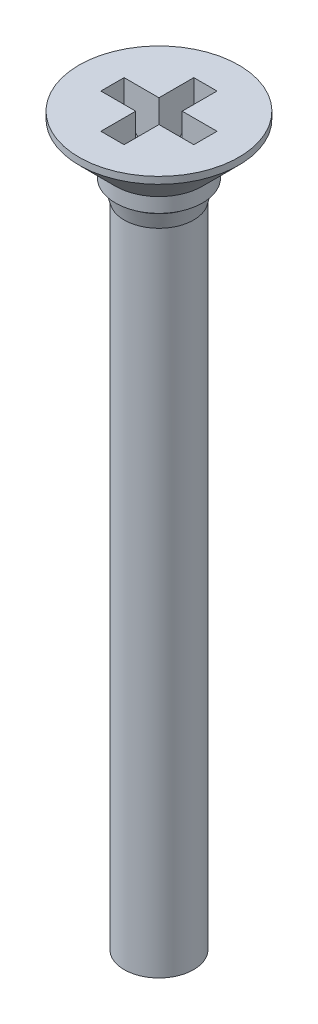
ISO-10303-21;
HEADER;
FILE_DESCRIPTION(('STEP AP214'),'2;1');
FILE_NAME('part.step','',(''),(''),'','','');
FILE_SCHEMA(('AUTOMOTIVE_DESIGN { 1 0 10303 214 1 1 1 1 }'));
ENDSEC;
DATA;
#1=APPLICATION_CONTEXT('core data for automotive mechanical design processes');
#2=APPLICATION_PROTOCOL_DEFINITION('international standard','automotive_design',2000,#1);
#3=PRODUCT_CONTEXT('',#1,'mechanical');
#4=PRODUCT('Part','Part','',(#3));
#5=PRODUCT_RELATED_PRODUCT_CATEGORY('part','',(#4));
#6=PRODUCT_DEFINITION_FORMATION('','',#4);
#7=PRODUCT_DEFINITION_CONTEXT('part definition',#1,'design');
#8=PRODUCT_DEFINITION('design','',#6,#7);
#9=PRODUCT_DEFINITION_SHAPE('','',#8);
#10=(LENGTH_UNIT() NAMED_UNIT(*) SI_UNIT(.MILLI.,.METRE.));
#11=(NAMED_UNIT(*) PLANE_ANGLE_UNIT() SI_UNIT($,.RADIAN.));
#12=(NAMED_UNIT(*) SI_UNIT($,.STERADIAN.) SOLID_ANGLE_UNIT());
#13=UNCERTAINTY_MEASURE_WITH_UNIT(LENGTH_MEASURE(1.E-05),#10,'distance_accuracy_value','');
#14=(GEOMETRIC_REPRESENTATION_CONTEXT(3) GLOBAL_UNCERTAINTY_ASSIGNED_CONTEXT((#13)) GLOBAL_UNIT_ASSIGNED_CONTEXT((#10,
#11,#12)) REPRESENTATION_CONTEXT('',''));
#15=CARTESIAN_POINT('',(0.,0.,0.));
#16=DIRECTION('',(0.,0.,1.));
#17=DIRECTION('',(1.,0.,0.));
#18=AXIS2_PLACEMENT_3D('',#15,#16,#17);
#19=CARTESIAN_POINT('',(0.,-2.65,-0.4));
#20=DIRECTION('',(0.,0.,-1.));
#21=DIRECTION('',(-1.,0.,0.));
#22=AXIS2_PLACEMENT_3D('',#19,#20,#21);
#23=PLANE('',#22);
#24=DIRECTION('',(0.,1.,0.));
#25=VECTOR('',#24,1.);
#26=CARTESIAN_POINT('',(0.4,-2.65,-0.4));
#27=LINE('',#26,#25);
#28=CARTESIAN_POINT('',(0.4,-2.1,-0.4));
#29=VERTEX_POINT('',#28);
#30=CARTESIAN_POINT('',(0.4,0.,-0.4));
#31=VERTEX_POINT('',#30);
#32=EDGE_CURVE('E203',#29,#31,#27,.T.);
#33=ORIENTED_EDGE('',*,*,#32,.F.);
#34=DIRECTION('',(1.,0.,0.));
#35=VECTOR('',#34,1.);
#36=CARTESIAN_POINT('',(-0.550000000000002,-2.1,-0.4));
#37=LINE('',#36,#35);
#38=CARTESIAN_POINT('',(0.550000000000002,-2.1,-0.4));
#39=VERTEX_POINT('',#38);
#40=EDGE_CURVE('E238',#29,#39,#37,.T.);
#41=ORIENTED_EDGE('',*,*,#40,.T.);
#42=DIRECTION('',(0.707106781186546,0.707106781186548,0.));
#43=VECTOR('',#42,1.);
#44=CARTESIAN_POINT('',(1.6,-1.05,-0.4));
#45=LINE('',#44,#43);
#46=CARTESIAN_POINT('',(1.6,-1.05,-0.4));
#47=VERTEX_POINT('',#46);
#48=EDGE_CURVE('E242',#39,#47,#45,.T.);
#49=ORIENTED_EDGE('',*,*,#48,.T.);
#50=DIRECTION('',(0.,1.,0.));
#51=VECTOR('',#50,1.);
#52=CARTESIAN_POINT('',(1.6,0.,-0.4));
#53=LINE('',#52,#51);
#54=CARTESIAN_POINT('',(1.6,0.,-0.4));
#55=VERTEX_POINT('',#54);
#56=EDGE_CURVE('E245',#47,#55,#53,.T.);
#57=ORIENTED_EDGE('',*,*,#56,.T.);
#58=DIRECTION('',(-1.,0.,0.));
#59=VECTOR('',#58,1.);
#60=CARTESIAN_POINT('',(1.6,0.,-0.4));
#61=LINE('',#60,#59);
#62=EDGE_CURVE('E249',#55,#31,#61,.T.);
#63=ORIENTED_EDGE('',*,*,#62,.T.);
#64=EDGE_LOOP('',(#33,#41,#49,#57,#63));
#65=FACE_BOUND('',#64,.T.);
#66=ADVANCED_FACE('F38',(#65),#23,.F.);
#67=CARTESIAN_POINT('',(0.,-2.65,0.4));
#68=DIRECTION('',(0.,0.,-1.));
#69=DIRECTION('',(-1.,0.,0.));
#70=AXIS2_PLACEMENT_3D('',#67,#68,#69);
#71=PLANE('',#70);
#72=DIRECTION('',(1.,0.,0.));
#73=VECTOR('',#72,1.);
#74=CARTESIAN_POINT('',(-0.550000000000002,-2.1,0.4));
#75=LINE('',#74,#73);
#76=CARTESIAN_POINT('',(0.4,-2.1,0.4));
#77=VERTEX_POINT('',#76);
#78=CARTESIAN_POINT('',(0.550000000000002,-2.1,0.4));
#79=VERTEX_POINT('',#78);
#80=EDGE_CURVE('E220',#77,#79,#75,.T.);
#81=ORIENTED_EDGE('',*,*,#80,.F.);
#82=DIRECTION('',(0.,1.,0.));
#83=VECTOR('',#82,1.);
#84=CARTESIAN_POINT('',(0.4,-2.65,0.4));
#85=LINE('',#84,#83);
#86=CARTESIAN_POINT('',(0.4,0.,0.4));
#87=VERTEX_POINT('',#86);
#88=EDGE_CURVE('E46',#77,#87,#85,.T.);
#89=ORIENTED_EDGE('',*,*,#88,.T.);
#90=DIRECTION('',(-1.,0.,0.));
#91=VECTOR('',#90,1.);
#92=CARTESIAN_POINT('',(1.6,0.,0.4));
#93=LINE('',#92,#91);
#94=CARTESIAN_POINT('',(1.6,0.,0.4));
#95=VERTEX_POINT('',#94);
#96=EDGE_CURVE('E229',#95,#87,#93,.T.);
#97=ORIENTED_EDGE('',*,*,#96,.F.);
#98=DIRECTION('',(0.,1.,0.));
#99=VECTOR('',#98,1.);
#100=CARTESIAN_POINT('',(1.6,0.,0.4));
#101=LINE('',#100,#99);
#102=CARTESIAN_POINT('',(1.6,-1.05,0.4));
#103=VERTEX_POINT('',#102);
#104=EDGE_CURVE('E226',#103,#95,#101,.T.);
#105=ORIENTED_EDGE('',*,*,#104,.F.);
#106=DIRECTION('',(0.707106781186546,0.707106781186548,0.));
#107=VECTOR('',#106,1.);
#108=CARTESIAN_POINT('',(1.6,-1.05,0.4));
#109=LINE('',#108,#107);
#110=EDGE_CURVE('E223',#79,#103,#109,.T.);
#111=ORIENTED_EDGE('',*,*,#110,.F.);
#112=EDGE_LOOP('',(#81,#89,#97,#105,#111));
#113=FACE_BOUND('',#112,.T.);
#114=ADVANCED_FACE('F292',(#113),#71,.T.);
#115=CARTESIAN_POINT('',(0.,0.,0.));
#116=DIRECTION('',(0.,-1.,0.));
#117=DIRECTION('',(1.,0.,0.));
#118=AXIS2_PLACEMENT_3D('',#115,#116,#117);
#119=PLANE('',#118);
#120=DIRECTION('',(1.,0.,0.));
#121=VECTOR('',#120,1.);
#122=CARTESIAN_POINT('',(-0.4,0.,1.6));
#123=LINE('',#122,#121);
#124=CARTESIAN_POINT('',(-0.4,0.,1.6));
#125=VERTEX_POINT('',#124);
#126=CARTESIAN_POINT('',(0.4,0.,1.6));
#127=VERTEX_POINT('',#126);
#128=EDGE_CURVE('E204',#125,#127,#123,.T.);
#129=ORIENTED_EDGE('',*,*,#128,.F.);
#130=DIRECTION('',(0.,0.,1.));
#131=VECTOR('',#130,1.);
#132=CARTESIAN_POINT('',(-0.4,0.,-1.6));
#133=LINE('',#132,#131);
#134=CARTESIAN_POINT('',(-0.4,0.,0.399999999999999));
#135=VERTEX_POINT('',#134);
#136=EDGE_CURVE('E197',#135,#125,#133,.T.);
#137=ORIENTED_EDGE('',*,*,#136,.F.);
#138=CARTESIAN_POINT('',(-1.6,0.,0.4));
#139=VERTEX_POINT('',#138);
#140=EDGE_CURVE('E228',#135,#139,#93,.T.);
#141=ORIENTED_EDGE('',*,*,#140,.T.);
#142=DIRECTION('',(0.,0.,1.));
#143=VECTOR('',#142,1.);
#144=CARTESIAN_POINT('',(-1.6,0.,-0.4));
#145=LINE('',#144,#143);
#146=CARTESIAN_POINT('',(-1.6,0.,-0.4));
#147=VERTEX_POINT('',#146);
#148=EDGE_CURVE('E259',#147,#139,#145,.T.);
#149=ORIENTED_EDGE('',*,*,#148,.F.);
#150=CARTESIAN_POINT('',(-0.4,0.,-0.4));
#151=VERTEX_POINT('',#150);
#152=EDGE_CURVE('E248',#151,#147,#61,.T.);
#153=ORIENTED_EDGE('',*,*,#152,.F.);
#154=CARTESIAN_POINT('',(-0.4,0.,-1.6));
#155=VERTEX_POINT('',#154);
#156=EDGE_CURVE('E198',#155,#151,#133,.T.);
#157=ORIENTED_EDGE('',*,*,#156,.F.);
#158=DIRECTION('',(1.,0.,0.));
#159=VECTOR('',#158,1.);
#160=CARTESIAN_POINT('',(-0.4,0.,-1.6));
#161=LINE('',#160,#159);
#162=CARTESIAN_POINT('',(0.4,0.,-1.6));
#163=VERTEX_POINT('',#162);
#164=EDGE_CURVE('E206',#155,#163,#161,.T.);
#165=ORIENTED_EDGE('',*,*,#164,.T.);
#166=DIRECTION('',(0.,0.,1.));
#167=VECTOR('',#166,1.);
#168=CARTESIAN_POINT('',(0.4,0.,-1.6));
#169=LINE('',#168,#167);
#170=EDGE_CURVE('E182',#163,#31,#169,.T.);
#171=ORIENTED_EDGE('',*,*,#170,.T.);
#172=ORIENTED_EDGE('',*,*,#62,.F.);
#173=DIRECTION('',(0.,0.,1.));
#174=VECTOR('',#173,1.);
#175=CARTESIAN_POINT('',(1.6,0.,-0.4));
#176=LINE('',#175,#174);
#177=EDGE_CURVE('E262',#55,#95,#176,.T.);
#178=ORIENTED_EDGE('',*,*,#177,.T.);
#179=ORIENTED_EDGE('',*,*,#96,.T.);
#180=EDGE_CURVE('E61',#87,#127,#169,.T.);
#181=ORIENTED_EDGE('',*,*,#180,.T.);
#182=EDGE_LOOP('',(#129,#137,#141,#149,#153,#157,#165,#171,#172,#178,#179,#181));
#183=FACE_BOUND('',#182,.T.);
#184=CARTESIAN_POINT('',(0.,0.,0.));
#185=DIRECTION('',(0.,1.,0.));
#186=DIRECTION('',(-1.,0.,0.));
#187=AXIS2_PLACEMENT_3D('',#184,#185,#186);
#188=CIRCLE('',#187,2.75);
#189=CARTESIAN_POINT('',(-2.75,0.,0.));
#190=VERTEX_POINT('',#189);
#191=EDGE_CURVE('E288',#190,#190,#188,.T.);
#192=ORIENTED_EDGE('',*,*,#191,.T.);
#193=EDGE_LOOP('',(#192));
#194=FACE_BOUND('',#193,.T.);
#195=ADVANCED_FACE('F40',(#183,#194),#119,.F.);
#196=CARTESIAN_POINT('',(0.,0.,0.));
#197=DIRECTION('',(0.,1.,0.));
#198=DIRECTION('',(-1.,0.,0.));
#199=AXIS2_PLACEMENT_3D('',#196,#197,#198);
#200=CYLINDRICAL_SURFACE('',#199,2.75);
#201=ORIENTED_EDGE('',*,*,#191,.F.);
#202=EDGE_LOOP('',(#201));
#203=FACE_BOUND('',#202,.T.);
#204=CARTESIAN_POINT('',(0.,-0.237500000000007,0.));
#205=DIRECTION('',(0.,1.,0.));
#206=DIRECTION('',(-1.,0.,0.));
#207=AXIS2_PLACEMENT_3D('',#204,#205,#206);
#208=CIRCLE('',#207,2.75);
#209=CARTESIAN_POINT('',(-2.75,-0.237500000000007,0.));
#210=VERTEX_POINT('',#209);
#211=EDGE_CURVE('E285',#210,#210,#208,.T.);
#212=ORIENTED_EDGE('',*,*,#211,.T.);
#213=EDGE_LOOP('',(#212));
#214=FACE_BOUND('',#213,.T.);
#215=ADVANCED_FACE('F397',(#203,#214),#200,.T.);
#216=CARTESIAN_POINT('',(0.,-1.4875,0.));
#217=DIRECTION('',(0.,1.,0.));
#218=DIRECTION('',(-1.,0.,0.));
#219=AXIS2_PLACEMENT_3D('',#216,#217,#218);
#220=CONICAL_SURFACE('',#219,1.5,0.78539816339745);
#221=ORIENTED_EDGE('',*,*,#211,.F.);
#222=EDGE_LOOP('',(#221));
#223=FACE_BOUND('',#222,.T.);
#224=CARTESIAN_POINT('',(0.,-1.4875,0.));
#225=DIRECTION('',(0.,1.,0.));
#226=DIRECTION('',(-1.,0.,0.));
#227=AXIS2_PLACEMENT_3D('',#224,#225,#226);
#228=CIRCLE('',#227,1.5);
#229=CARTESIAN_POINT('',(-1.5,-1.4875,0.));
#230=VERTEX_POINT('',#229);
#231=EDGE_CURVE('E282',#230,#230,#228,.T.);
#232=ORIENTED_EDGE('',*,*,#231,.T.);
#233=EDGE_LOOP('',(#232));
#234=FACE_BOUND('',#233,.T.);
#235=ADVANCED_FACE('F394',(#223,#234),#220,.T.);
#236=CARTESIAN_POINT('',(0.,0.,0.));
#237=DIRECTION('',(0.,1.,0.));
#238=DIRECTION('',(-1.,0.,0.));
#239=AXIS2_PLACEMENT_3D('',#236,#237,#238);
#240=CYLINDRICAL_SURFACE('',#239,1.5);
#241=ORIENTED_EDGE('',*,*,#231,.F.);
#242=EDGE_LOOP('',(#241));
#243=FACE_BOUND('',#242,.T.);
#244=CARTESIAN_POINT('',(0.,-1.9875,0.));
#245=DIRECTION('',(0.,1.,0.));
#246=DIRECTION('',(-1.,0.,0.));
#247=AXIS2_PLACEMENT_3D('',#244,#245,#246);
#248=CIRCLE('',#247,1.5);
#249=CARTESIAN_POINT('',(-1.5,-1.9875,0.));
#250=VERTEX_POINT('',#249);
#251=EDGE_CURVE('E279',#250,#250,#248,.T.);
#252=ORIENTED_EDGE('',*,*,#251,.T.);
#253=EDGE_LOOP('',(#252));
#254=FACE_BOUND('',#253,.T.);
#255=ADVANCED_FACE('F390',(#243,#254),#240,.T.);
#256=CARTESIAN_POINT('',(1.5,-1.9875,0.));
#257=DIRECTION('',(0.,1.,0.));
#258=DIRECTION('',(-1.,0.,0.));
#259=AXIS2_PLACEMENT_3D('',#256,#257,#258);
#260=PLANE('',#259);
#261=ORIENTED_EDGE('',*,*,#251,.F.);
#262=EDGE_LOOP('',(#261));
#263=FACE_BOUND('',#262,.T.);
#264=CARTESIAN_POINT('',(0.,-1.9875,0.));
#265=DIRECTION('',(0.,1.,0.));
#266=DIRECTION('',(-1.,0.,0.));
#267=AXIS2_PLACEMENT_3D('',#264,#265,#266);
#268=CIRCLE('',#267,1.3375);
#269=CARTESIAN_POINT('',(-1.3375,-1.9875,0.));
#270=VERTEX_POINT('',#269);
#271=EDGE_CURVE('E276',#270,#270,#268,.T.);
#272=ORIENTED_EDGE('',*,*,#271,.T.);
#273=EDGE_LOOP('',(#272));
#274=FACE_BOUND('',#273,.T.);
#275=ADVANCED_FACE('F386',(#263,#274),#260,.F.);
#276=CARTESIAN_POINT('',(0.,0.,0.));
#277=DIRECTION('',(0.,1.,0.));
#278=DIRECTION('',(-1.,0.,0.));
#279=AXIS2_PLACEMENT_3D('',#276,#277,#278);
#280=CYLINDRICAL_SURFACE('',#279,1.3375);
#281=ORIENTED_EDGE('',*,*,#271,.F.);
#282=EDGE_LOOP('',(#281));
#283=FACE_BOUND('',#282,.T.);
#284=CARTESIAN_POINT('',(0.,-2.11258468371008,0.));
#285=DIRECTION('',(0.,1.,0.));
#286=DIRECTION('',(-1.,0.,0.));
#287=AXIS2_PLACEMENT_3D('',#284,#285,#286);
#288=CIRCLE('',#287,1.3375);
#289=CARTESIAN_POINT('',(-1.3375,-2.11258468371008,0.));
#290=VERTEX_POINT('',#289);
#291=EDGE_CURVE('E273',#290,#290,#288,.T.);
#292=ORIENTED_EDGE('',*,*,#291,.T.);
#293=EDGE_LOOP('',(#292));
#294=FACE_BOUND('',#293,.T.);
#295=ADVANCED_FACE('F382',(#283,#294),#280,.T.);
#296=CARTESIAN_POINT('',(0.,-2.65,0.));
#297=DIRECTION('',(0.,1.,0.));
#298=DIRECTION('',(-1.,0.,0.));
#299=AXIS2_PLACEMENT_3D('',#296,#297,#298);
#300=CONICAL_SURFACE('',#299,1.1935,0.26179938779915);
#301=ORIENTED_EDGE('',*,*,#291,.F.);
#302=EDGE_LOOP('',(#301));
#303=FACE_BOUND('',#302,.T.);
#304=CARTESIAN_POINT('',(0.,-2.65,0.));
#305=DIRECTION('',(0.,1.,0.));
#306=DIRECTION('',(-1.,0.,0.));
#307=AXIS2_PLACEMENT_3D('',#304,#305,#306);
#308=CIRCLE('',#307,1.1935);
#309=CARTESIAN_POINT('',(-1.1935,-2.65,0.));
#310=VERTEX_POINT('',#309);
#311=EDGE_CURVE('E258',#310,#310,#308,.T.);
#312=ORIENTED_EDGE('',*,*,#311,.T.);
#313=EDGE_LOOP('',(#312));
#314=FACE_BOUND('',#313,.T.);
#315=ADVANCED_FACE('F378',(#303,#314),#300,.T.);
#316=CARTESIAN_POINT('',(0.,0.,0.));
#317=DIRECTION('',(0.,1.,0.));
#318=DIRECTION('',(-1.,0.,0.));
#319=AXIS2_PLACEMENT_3D('',#316,#317,#318);
#320=CYLINDRICAL_SURFACE('',#319,1.1935);
#321=ORIENTED_EDGE('',*,*,#311,.F.);
#322=EDGE_LOOP('',(#321));
#323=FACE_BOUND('',#322,.T.);
#324=CARTESIAN_POINT('',(0.,-25.,0.));
#325=DIRECTION('',(0.,-1.,0.));
#326=DIRECTION('',(1.,0.,0.));
#327=AXIS2_PLACEMENT_3D('',#324,#325,#326);
#328=CIRCLE('',#327,1.1935);
#329=CARTESIAN_POINT('',(1.1935,-25.,0.));
#330=VERTEX_POINT('',#329);
#331=EDGE_CURVE('E173',#330,#330,#328,.T.);
#332=ORIENTED_EDGE('',*,*,#331,.F.);
#333=EDGE_LOOP('',(#332));
#334=FACE_BOUND('',#333,.T.);
#335=ADVANCED_FACE('F375',(#323,#334),#320,.T.);
#336=CARTESIAN_POINT('',(-1.6,-1.05,-0.4));
#337=DIRECTION('',(-0.707106781186548,-0.707106781186546,0.));
#338=DIRECTION('',(0.707106781186547,-0.707106781186548,0.));
#339=AXIS2_PLACEMENT_3D('',#336,#337,#338);
#340=PLANE('',#339);
#341=DIRECTION('',(0.,0.,1.));
#342=VECTOR('',#341,1.);
#343=CARTESIAN_POINT('',(-0.550000000000002,-2.1,-0.4));
#344=LINE('',#343,#342);
#345=CARTESIAN_POINT('',(-0.550000000000002,-2.1,-0.4));
#346=VERTEX_POINT('',#345);
#347=CARTESIAN_POINT('',(-0.550000000000002,-2.1,0.4));
#348=VERTEX_POINT('',#347);
#349=EDGE_CURVE('E255',#346,#348,#344,.T.);
#350=ORIENTED_EDGE('',*,*,#349,.F.);
#351=DIRECTION('',(0.707106781186546,-0.707106781186548,0.));
#352=VECTOR('',#351,1.);
#353=CARTESIAN_POINT('',(-1.6,-1.05,-0.4));
#354=LINE('',#353,#352);
#355=CARTESIAN_POINT('',(-1.6,-1.05,-0.4));
#356=VERTEX_POINT('',#355);
#357=EDGE_CURVE('E235',#356,#346,#354,.T.);
#358=ORIENTED_EDGE('',*,*,#357,.F.);
#359=DIRECTION('',(0.,0.,1.));
#360=VECTOR('',#359,1.);
#361=CARTESIAN_POINT('',(-1.6,-1.05,-0.4));
#362=LINE('',#361,#360);
#363=CARTESIAN_POINT('',(-1.6,-1.05,0.4));
#364=VERTEX_POINT('',#363);
#365=EDGE_CURVE('E256',#356,#364,#362,.T.);
#366=ORIENTED_EDGE('',*,*,#365,.T.);
#367=DIRECTION('',(0.707106781186546,-0.707106781186548,0.));
#368=VECTOR('',#367,1.);
#369=CARTESIAN_POINT('',(-1.6,-1.05,0.4));
#370=LINE('',#369,#368);
#371=EDGE_CURVE('E217',#364,#348,#370,.T.);
#372=ORIENTED_EDGE('',*,*,#371,.T.);
#373=EDGE_LOOP('',(#350,#358,#366,#372));
#374=FACE_BOUND('',#373,.T.);
#375=ADVANCED_FACE('F329',(#374),#340,.F.);
#376=CARTESIAN_POINT('',(-1.6,0.,-0.4));
#377=DIRECTION('',(-1.,0.,0.));
#378=DIRECTION('',(0.,0.,1.));
#379=AXIS2_PLACEMENT_3D('',#376,#377,#378);
#380=PLANE('',#379);
#381=ORIENTED_EDGE('',*,*,#365,.F.);
#382=DIRECTION('',(0.,-1.,0.));
#383=VECTOR('',#382,1.);
#384=CARTESIAN_POINT('',(-1.6,0.,-0.4));
#385=LINE('',#384,#383);
#386=EDGE_CURVE('E252',#147,#356,#385,.T.);
#387=ORIENTED_EDGE('',*,*,#386,.F.);
#388=ORIENTED_EDGE('',*,*,#148,.T.);
#389=DIRECTION('',(0.,-1.,0.));
#390=VECTOR('',#389,1.);
#391=CARTESIAN_POINT('',(-1.6,0.,0.4));
#392=LINE('',#391,#390);
#393=EDGE_CURVE('E232',#139,#364,#392,.T.);
#394=ORIENTED_EDGE('',*,*,#393,.T.);
#395=EDGE_LOOP('',(#381,#387,#388,#394));
#396=FACE_BOUND('',#395,.T.);
#397=ADVANCED_FACE('F374',(#396),#380,.F.);
#398=CARTESIAN_POINT('',(1.6,0.,-0.4));
#399=DIRECTION('',(1.,0.,0.));
#400=DIRECTION('',(0.,0.,-1.));
#401=AXIS2_PLACEMENT_3D('',#398,#399,#400);
#402=PLANE('',#401);
#403=ORIENTED_EDGE('',*,*,#177,.F.);
#404=ORIENTED_EDGE('',*,*,#56,.F.);
#405=DIRECTION('',(0.,0.,1.));
#406=VECTOR('',#405,1.);
#407=CARTESIAN_POINT('',(1.6,-1.05,-0.4));
#408=LINE('',#407,#406);
#409=EDGE_CURVE('E265',#47,#103,#408,.T.);
#410=ORIENTED_EDGE('',*,*,#409,.T.);
#411=ORIENTED_EDGE('',*,*,#104,.T.);
#412=EDGE_LOOP('',(#403,#404,#410,#411));
#413=FACE_BOUND('',#412,.T.);
#414=ADVANCED_FACE('F301',(#413),#402,.F.);
#415=CARTESIAN_POINT('',(1.6,-1.05,-0.4));
#416=DIRECTION('',(0.707106781186548,-0.707106781186546,0.));
#417=DIRECTION('',(0.707106781186547,0.707106781186548,0.));
#418=AXIS2_PLACEMENT_3D('',#415,#416,#417);
#419=PLANE('',#418);
#420=ORIENTED_EDGE('',*,*,#409,.F.);
#421=ORIENTED_EDGE('',*,*,#48,.F.);
#422=DIRECTION('',(0.,0.,1.));
#423=VECTOR('',#422,1.);
#424=CARTESIAN_POINT('',(0.550000000000002,-2.1,-0.4));
#425=LINE('',#424,#423);
#426=EDGE_CURVE('E267',#39,#79,#425,.T.);
#427=ORIENTED_EDGE('',*,*,#426,.T.);
#428=ORIENTED_EDGE('',*,*,#110,.T.);
#429=EDGE_LOOP('',(#420,#421,#427,#428));
#430=FACE_BOUND('',#429,.T.);
#431=ADVANCED_FACE('F307',(#430),#419,.F.);
#432=CARTESIAN_POINT('',(-0.550000000000002,-2.1,-0.4));
#433=DIRECTION('',(0.,-1.,0.));
#434=DIRECTION('',(0.,0.,-1.));
#435=AXIS2_PLACEMENT_3D('',#432,#433,#434);
#436=PLANE('',#435);
#437=CARTESIAN_POINT('',(-0.4,-2.1,0.4));
#438=VERTEX_POINT('',#437);
#439=EDGE_CURVE('E221',#348,#438,#75,.T.);
#440=ORIENTED_EDGE('',*,*,#439,.T.);
#441=DIRECTION('',(0.,0.,-1.));
#442=VECTOR('',#441,1.);
#443=CARTESIAN_POINT('',(-0.4,-2.1,0.550000000000002));
#444=LINE('',#443,#442);
#445=CARTESIAN_POINT('',(-0.4,-2.1,0.550000000000002));
#446=VERTEX_POINT('',#445);
#447=EDGE_CURVE('E157',#446,#438,#444,.T.);
#448=ORIENTED_EDGE('',*,*,#447,.F.);
#449=DIRECTION('',(1.,0.,0.));
#450=VECTOR('',#449,1.);
#451=CARTESIAN_POINT('',(-0.4,-2.1,0.550000000000002));
#452=LINE('',#451,#450);
#453=CARTESIAN_POINT('',(0.4,-2.1,0.550000000000002));
#454=VERTEX_POINT('',#453);
#455=EDGE_CURVE('E151',#446,#454,#452,.T.);
#456=ORIENTED_EDGE('',*,*,#455,.T.);
#457=DIRECTION('',(0.,0.,-1.));
#458=VECTOR('',#457,1.);
#459=CARTESIAN_POINT('',(0.4,-2.1,0.550000000000002));
#460=LINE('',#459,#458);
#461=EDGE_CURVE('E155',#454,#77,#460,.T.);
#462=ORIENTED_EDGE('',*,*,#461,.T.);
#463=ORIENTED_EDGE('',*,*,#80,.T.);
#464=ORIENTED_EDGE('',*,*,#426,.F.);
#465=ORIENTED_EDGE('',*,*,#40,.F.);
#466=CARTESIAN_POINT('',(0.4,-2.1,-0.550000000000002));
#467=VERTEX_POINT('',#466);
#468=EDGE_CURVE('E53',#29,#467,#460,.T.);
#469=ORIENTED_EDGE('',*,*,#468,.T.);
#470=DIRECTION('',(1.,0.,0.));
#471=VECTOR('',#470,1.);
#472=CARTESIAN_POINT('',(-0.4,-2.1,-0.550000000000002));
#473=LINE('',#472,#471);
#474=CARTESIAN_POINT('',(-0.4,-2.1,-0.550000000000002));
#475=VERTEX_POINT('',#474);
#476=EDGE_CURVE('E162',#475,#467,#473,.T.);
#477=ORIENTED_EDGE('',*,*,#476,.F.);
#478=CARTESIAN_POINT('',(-0.4,-2.1,-0.4));
#479=VERTEX_POINT('',#478);
#480=EDGE_CURVE('E189',#479,#475,#444,.T.);
#481=ORIENTED_EDGE('',*,*,#480,.F.);
#482=EDGE_CURVE('E239',#346,#479,#37,.T.);
#483=ORIENTED_EDGE('',*,*,#482,.F.);
#484=ORIENTED_EDGE('',*,*,#349,.T.);
#485=EDGE_LOOP('',(#440,#448,#456,#462,#463,#464,#465,#469,#477,#481,#483,#484));
#486=FACE_BOUND('',#485,.T.);
#487=ADVANCED_FACE('F154',(#486),#436,.F.);
#488=ORIENTED_EDGE('',*,*,#482,.T.);
#489=DIRECTION('',(0.,1.,0.));
#490=VECTOR('',#489,1.);
#491=CARTESIAN_POINT('',(-0.4,-2.65,-0.4));
#492=LINE('',#491,#490);
#493=EDGE_CURVE('E214',#479,#151,#492,.T.);
#494=ORIENTED_EDGE('',*,*,#493,.T.);
#495=ORIENTED_EDGE('',*,*,#152,.T.);
#496=ORIENTED_EDGE('',*,*,#386,.T.);
#497=ORIENTED_EDGE('',*,*,#357,.T.);
#498=EDGE_LOOP('',(#488,#494,#495,#496,#497));
#499=FACE_BOUND('',#498,.T.);
#500=ADVANCED_FACE('F324',(#499),#23,.F.);
#501=DIRECTION('',(0.,1.,0.));
#502=VECTOR('',#501,1.);
#503=CARTESIAN_POINT('',(-0.4,-2.65,0.4));
#504=LINE('',#503,#502);
#505=EDGE_CURVE('E11',#438,#135,#504,.T.);
#506=ORIENTED_EDGE('',*,*,#505,.F.);
#507=ORIENTED_EDGE('',*,*,#439,.F.);
#508=ORIENTED_EDGE('',*,*,#371,.F.);
#509=ORIENTED_EDGE('',*,*,#393,.F.);
#510=ORIENTED_EDGE('',*,*,#140,.F.);
#511=EDGE_LOOP('',(#506,#507,#508,#509,#510));
#512=FACE_BOUND('',#511,.T.);
#513=ADVANCED_FACE('F334',(#512),#71,.T.);
#514=CARTESIAN_POINT('',(-0.4,-1.05,1.6));
#515=DIRECTION('',(0.,-0.707106781186546,0.707106781186548));
#516=DIRECTION('',(0.,-0.707106781186548,-0.707106781186547));
#517=AXIS2_PLACEMENT_3D('',#514,#515,#516);
#518=PLANE('',#517);
#519=ORIENTED_EDGE('',*,*,#455,.F.);
#520=DIRECTION('',(0.,-0.707106781186548,-0.707106781186546));
#521=VECTOR('',#520,1.);
#522=CARTESIAN_POINT('',(-0.4,-1.05,1.6));
#523=LINE('',#522,#521);
#524=CARTESIAN_POINT('',(-0.4,-1.05,1.6));
#525=VERTEX_POINT('',#524);
#526=EDGE_CURVE('E187',#525,#446,#523,.T.);
#527=ORIENTED_EDGE('',*,*,#526,.F.);
#528=DIRECTION('',(1.,0.,0.));
#529=VECTOR('',#528,1.);
#530=CARTESIAN_POINT('',(-0.4,-1.05,1.6));
#531=LINE('',#530,#529);
#532=CARTESIAN_POINT('',(0.4,-1.05,1.6));
#533=VERTEX_POINT('',#532);
#534=EDGE_CURVE('E171',#525,#533,#531,.T.);
#535=ORIENTED_EDGE('',*,*,#534,.T.);
#536=DIRECTION('',(0.,-0.707106781186548,-0.707106781186546));
#537=VECTOR('',#536,1.);
#538=CARTESIAN_POINT('',(0.4,-1.05,1.6));
#539=LINE('',#538,#537);
#540=EDGE_CURVE('E167',#533,#454,#539,.T.);
#541=ORIENTED_EDGE('',*,*,#540,.T.);
#542=EDGE_LOOP('',(#519,#527,#535,#541));
#543=FACE_BOUND('',#542,.T.);
#544=ADVANCED_FACE('F170',(#543),#518,.F.);
#545=CARTESIAN_POINT('',(-0.4,-2.65,0.));
#546=DIRECTION('',(-1.,0.,0.));
#547=DIRECTION('',(0.,0.,1.));
#548=AXIS2_PLACEMENT_3D('',#545,#546,#547);
#549=PLANE('',#548);
#550=ORIENTED_EDGE('',*,*,#505,.T.);
#551=ORIENTED_EDGE('',*,*,#136,.T.);
#552=DIRECTION('',(0.,-1.,0.));
#553=VECTOR('',#552,1.);
#554=CARTESIAN_POINT('',(-0.4,0.,1.6));
#555=LINE('',#554,#553);
#556=EDGE_CURVE('E163',#125,#525,#555,.T.);
#557=ORIENTED_EDGE('',*,*,#556,.T.);
#558=ORIENTED_EDGE('',*,*,#526,.T.);
#559=ORIENTED_EDGE('',*,*,#447,.T.);
#560=EDGE_LOOP('',(#550,#551,#557,#558,#559));
#561=FACE_BOUND('',#560,.T.);
#562=ADVANCED_FACE('F339',(#561),#549,.F.);
#563=CARTESIAN_POINT('',(0.4,-2.65,0.));
#564=DIRECTION('',(-1.,0.,0.));
#565=DIRECTION('',(0.,0.,1.));
#566=AXIS2_PLACEMENT_3D('',#563,#564,#565);
#567=PLANE('',#566);
#568=ORIENTED_EDGE('',*,*,#461,.F.);
#569=ORIENTED_EDGE('',*,*,#540,.F.);
#570=DIRECTION('',(0.,-1.,0.));
#571=VECTOR('',#570,1.);
#572=CARTESIAN_POINT('',(0.4,0.,1.6));
#573=LINE('',#572,#571);
#574=EDGE_CURVE('E185',#127,#533,#573,.T.);
#575=ORIENTED_EDGE('',*,*,#574,.F.);
#576=ORIENTED_EDGE('',*,*,#180,.F.);
#577=ORIENTED_EDGE('',*,*,#88,.F.);
#578=EDGE_LOOP('',(#568,#569,#575,#576,#577));
#579=FACE_BOUND('',#578,.T.);
#580=ADVANCED_FACE('F166',(#579),#567,.T.);
#581=CARTESIAN_POINT('',(-0.4,0.,1.6));
#582=DIRECTION('',(0.,0.,1.));
#583=DIRECTION('',(1.,0.,0.));
#584=AXIS2_PLACEMENT_3D('',#581,#582,#583);
#585=PLANE('',#584);
#586=ORIENTED_EDGE('',*,*,#534,.F.);
#587=ORIENTED_EDGE('',*,*,#556,.F.);
#588=ORIENTED_EDGE('',*,*,#128,.T.);
#589=ORIENTED_EDGE('',*,*,#574,.T.);
#590=EDGE_LOOP('',(#586,#587,#588,#589));
#591=FACE_BOUND('',#590,.T.);
#592=ADVANCED_FACE('F343',(#591),#585,.F.);
#593=ORIENTED_EDGE('',*,*,#480,.T.);
#594=DIRECTION('',(0.,0.707106781186548,-0.707106781186546));
#595=VECTOR('',#594,1.);
#596=CARTESIAN_POINT('',(-0.4,-1.05,-1.6));
#597=LINE('',#596,#595);
#598=CARTESIAN_POINT('',(-0.4,-1.05,-1.6));
#599=VERTEX_POINT('',#598);
#600=EDGE_CURVE('E191',#475,#599,#597,.T.);
#601=ORIENTED_EDGE('',*,*,#600,.T.);
#602=DIRECTION('',(0.,1.,0.));
#603=VECTOR('',#602,1.);
#604=CARTESIAN_POINT('',(-0.4,0.,-1.6));
#605=LINE('',#604,#603);
#606=EDGE_CURVE('E194',#599,#155,#605,.T.);
#607=ORIENTED_EDGE('',*,*,#606,.T.);
#608=ORIENTED_EDGE('',*,*,#156,.T.);
#609=ORIENTED_EDGE('',*,*,#493,.F.);
#610=EDGE_LOOP('',(#593,#601,#607,#608,#609));
#611=FACE_BOUND('',#610,.T.);
#612=ADVANCED_FACE('F321',(#611),#549,.F.);
#613=ORIENTED_EDGE('',*,*,#32,.T.);
#614=ORIENTED_EDGE('',*,*,#170,.F.);
#615=DIRECTION('',(0.,1.,0.));
#616=VECTOR('',#615,1.);
#617=CARTESIAN_POINT('',(0.4,0.,-1.6));
#618=LINE('',#617,#616);
#619=CARTESIAN_POINT('',(0.4,-1.05,-1.6));
#620=VERTEX_POINT('',#619);
#621=EDGE_CURVE('E180',#620,#163,#618,.T.);
#622=ORIENTED_EDGE('',*,*,#621,.F.);
#623=DIRECTION('',(0.,0.707106781186548,-0.707106781186546));
#624=VECTOR('',#623,1.);
#625=CARTESIAN_POINT('',(0.4,-1.05,-1.6));
#626=LINE('',#625,#624);
#627=EDGE_CURVE('E168',#467,#620,#626,.T.);
#628=ORIENTED_EDGE('',*,*,#627,.F.);
#629=ORIENTED_EDGE('',*,*,#468,.F.);
#630=EDGE_LOOP('',(#613,#614,#622,#628,#629));
#631=FACE_BOUND('',#630,.T.);
#632=ADVANCED_FACE('F314',(#631),#567,.T.);
#633=CARTESIAN_POINT('',(-0.4,0.,-1.6));
#634=DIRECTION('',(0.,0.,-1.));
#635=DIRECTION('',(-1.,0.,0.));
#636=AXIS2_PLACEMENT_3D('',#633,#634,#635);
#637=PLANE('',#636);
#638=ORIENTED_EDGE('',*,*,#164,.F.);
#639=ORIENTED_EDGE('',*,*,#606,.F.);
#640=DIRECTION('',(1.,0.,0.));
#641=VECTOR('',#640,1.);
#642=CARTESIAN_POINT('',(-0.4,-1.05,-1.6));
#643=LINE('',#642,#641);
#644=EDGE_CURVE('E209',#599,#620,#643,.T.);
#645=ORIENTED_EDGE('',*,*,#644,.T.);
#646=ORIENTED_EDGE('',*,*,#621,.T.);
#647=EDGE_LOOP('',(#638,#639,#645,#646));
#648=FACE_BOUND('',#647,.T.);
#649=ADVANCED_FACE('F317',(#648),#637,.F.);
#650=CARTESIAN_POINT('',(-0.4,-1.05,-1.6));
#651=DIRECTION('',(0.,-0.707106781186546,-0.707106781186548));
#652=DIRECTION('',(0.,0.707106781186548,-0.707106781186547));
#653=AXIS2_PLACEMENT_3D('',#650,#651,#652);
#654=PLANE('',#653);
#655=ORIENTED_EDGE('',*,*,#644,.F.);
#656=ORIENTED_EDGE('',*,*,#600,.F.);
#657=ORIENTED_EDGE('',*,*,#476,.T.);
#658=ORIENTED_EDGE('',*,*,#627,.T.);
#659=EDGE_LOOP('',(#655,#656,#657,#658));
#660=FACE_BOUND('',#659,.T.);
#661=ADVANCED_FACE('F312',(#660),#654,.F.);
#662=CARTESIAN_POINT('',(0.,-25.,0.));
#663=DIRECTION('',(0.,-1.,0.));
#664=DIRECTION('',(1.,0.,0.));
#665=AXIS2_PLACEMENT_3D('',#662,#663,#664);
#666=PLANE('',#665);
#667=ORIENTED_EDGE('',*,*,#331,.T.);
#668=EDGE_LOOP('',(#667));
#669=FACE_BOUND('',#668,.T.);
#670=ADVANCED_FACE('F420',(#669),#666,.T.);
#671=CLOSED_SHELL('',(#66,#114,#195,#215,#235,#255,#275,#295,#315,#335,#375,#397,#414,#431,#487,
#500,#513,#544,#562,#580,#592,#612,#632,#649,#661,#670));
#672=MANIFOLD_SOLID_BREP('B2',#671);
#673=ADVANCED_BREP_SHAPE_REPRESENTATION('',(#18,#672),#14);
#674=SHAPE_DEFINITION_REPRESENTATION(#9,#673);
ENDSEC;
END-ISO-10303-21;
